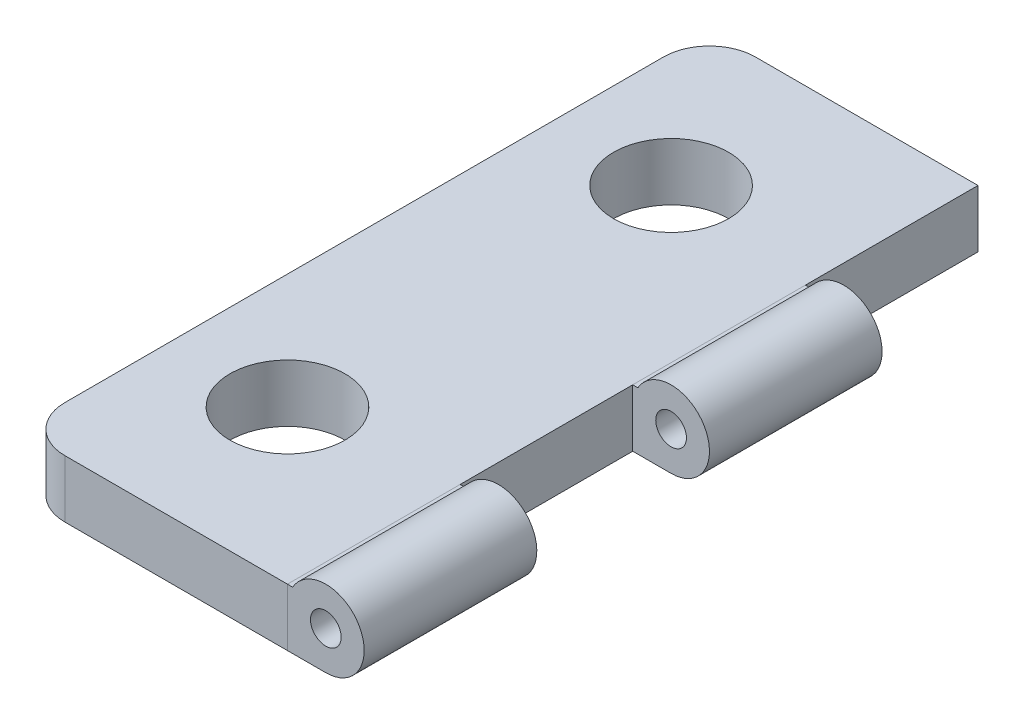
ISO-10303-21;
HEADER;
FILE_DESCRIPTION(('STEP AP214'),'2;1');
FILE_NAME('part.step','',(''),(''),'','','');
FILE_SCHEMA(('AUTOMOTIVE_DESIGN { 1 0 10303 214 1 1 1 1 }'));
ENDSEC;
DATA;
#1=APPLICATION_CONTEXT('core data for automotive mechanical design processes');
#2=APPLICATION_PROTOCOL_DEFINITION('international standard','automotive_design',2000,#1);
#3=PRODUCT_CONTEXT('',#1,'mechanical');
#4=PRODUCT('Part','Part','',(#3));
#5=PRODUCT_RELATED_PRODUCT_CATEGORY('part','',(#4));
#6=PRODUCT_DEFINITION_FORMATION('','',#4);
#7=PRODUCT_DEFINITION_CONTEXT('part definition',#1,'design');
#8=PRODUCT_DEFINITION('design','',#6,#7);
#9=PRODUCT_DEFINITION_SHAPE('','',#8);
#10=(LENGTH_UNIT() NAMED_UNIT(*) SI_UNIT(.MILLI.,.METRE.));
#11=(NAMED_UNIT(*) PLANE_ANGLE_UNIT() SI_UNIT($,.RADIAN.));
#12=(NAMED_UNIT(*) SI_UNIT($,.STERADIAN.) SOLID_ANGLE_UNIT());
#13=UNCERTAINTY_MEASURE_WITH_UNIT(LENGTH_MEASURE(1.E-05),#10,'distance_accuracy_value','');
#14=(GEOMETRIC_REPRESENTATION_CONTEXT(3) GLOBAL_UNCERTAINTY_ASSIGNED_CONTEXT((#13)) GLOBAL_UNIT_ASSIGNED_CONTEXT((#10,
#11,#12)) REPRESENTATION_CONTEXT('',''));
#15=CARTESIAN_POINT('',(0.,0.,0.));
#16=DIRECTION('',(0.,0.,1.));
#17=DIRECTION('',(1.,0.,0.));
#18=AXIS2_PLACEMENT_3D('',#15,#16,#17);
#19=CARTESIAN_POINT('',(8.,1.,-18.));
#20=DIRECTION('',(0.,0.,1.));
#21=DIRECTION('',(1.,0.,0.));
#22=AXIS2_PLACEMENT_3D('',#19,#20,#21);
#23=CYLINDRICAL_SURFACE('',#22,1.);
#24=CARTESIAN_POINT('',(8.,1.,-4.5));
#25=DIRECTION('',(0.,0.,1.));
#26=DIRECTION('',(1.,0.,0.));
#27=AXIS2_PLACEMENT_3D('',#24,#25,#26);
#28=CIRCLE('',#27,1.);
#29=CARTESIAN_POINT('',(7.13397459621556,1.5,-4.5));
#30=VERTEX_POINT('',#29);
#31=CARTESIAN_POINT('',(8.,0.,-4.5));
#32=VERTEX_POINT('',#31);
#33=EDGE_CURVE('E58',#30,#32,#28,.F.);
#34=ORIENTED_EDGE('',*,*,#33,.F.);
#35=DIRECTION('',(0.,0.,1.));
#36=VECTOR('',#35,1.);
#37=CARTESIAN_POINT('',(7.13397459621556,1.5,-18.));
#38=LINE('',#37,#36);
#39=CARTESIAN_POINT('',(7.13397459621556,1.5,0.));
#40=VERTEX_POINT('',#39);
#41=EDGE_CURVE('E52',#30,#40,#38,.T.);
#42=ORIENTED_EDGE('',*,*,#41,.T.);
#43=CARTESIAN_POINT('',(8.,1.,0.));
#44=DIRECTION('',(0.,0.,1.));
#45=DIRECTION('',(1.,0.,0.));
#46=AXIS2_PLACEMENT_3D('',#43,#44,#45);
#47=CIRCLE('',#46,1.);
#48=CARTESIAN_POINT('',(8.,0.,0.));
#49=VERTEX_POINT('',#48);
#50=EDGE_CURVE('E96',#49,#40,#47,.T.);
#51=ORIENTED_EDGE('',*,*,#50,.F.);
#52=DIRECTION('',(0.,0.,1.));
#53=VECTOR('',#52,1.);
#54=CARTESIAN_POINT('',(8.,0.,-18.));
#55=LINE('',#54,#53);
#56=EDGE_CURVE('E92',#32,#49,#55,.T.);
#57=ORIENTED_EDGE('',*,*,#56,.F.);
#58=EDGE_LOOP('',(#34,#42,#51,#57));
#59=FACE_BOUND('',#58,.T.);
#60=ADVANCED_FACE('F48',(#59),#23,.T.);
#61=CARTESIAN_POINT('',(0.,0.,-18.));
#62=DIRECTION('',(0.,-1.,0.));
#63=DIRECTION('',(0.,0.,-1.));
#64=AXIS2_PLACEMENT_3D('',#61,#62,#63);
#65=PLANE('',#64);
#66=DIRECTION('',(-1.,0.,0.));
#67=VECTOR('',#66,1.);
#68=CARTESIAN_POINT('',(9.,0.,-4.5));
#69=LINE('',#68,#67);
#70=CARTESIAN_POINT('',(7.,0.,-4.5));
#71=VERTEX_POINT('',#70);
#72=EDGE_CURVE('E12',#32,#71,#69,.T.);
#73=ORIENTED_EDGE('',*,*,#72,.F.);
#74=ORIENTED_EDGE('',*,*,#56,.T.);
#75=DIRECTION('',(1.,0.,0.));
#76=VECTOR('',#75,1.);
#77=CARTESIAN_POINT('',(0.,0.,0.));
#78=LINE('',#77,#76);
#79=CARTESIAN_POINT('',(7.,0.,0.));
#80=VERTEX_POINT('',#79);
#81=EDGE_CURVE('E105',#80,#49,#78,.T.);
#82=ORIENTED_EDGE('',*,*,#81,.F.);
#83=DIRECTION('',(0.,0.,1.));
#84=VECTOR('',#83,1.);
#85=CARTESIAN_POINT('',(7.,0.,-18.));
#86=LINE('',#85,#84);
#87=EDGE_CURVE('E121',#71,#80,#86,.T.);
#88=ORIENTED_EDGE('',*,*,#87,.F.);
#89=EDGE_LOOP('',(#73,#74,#82,#88));
#90=FACE_BOUND('',#89,.T.);
#91=ADVANCED_FACE('F128',(#90),#65,.T.);
#92=CARTESIAN_POINT('',(7.,0.,-18.));
#93=DIRECTION('',(1.,0.,0.));
#94=DIRECTION('',(0.,0.,-1.));
#95=AXIS2_PLACEMENT_3D('',#92,#93,#94);
#96=PLANE('',#95);
#97=DIRECTION('',(0.,0.,1.));
#98=VECTOR('',#97,1.);
#99=CARTESIAN_POINT('',(7.,1.5,-18.));
#100=LINE('',#99,#98);
#101=CARTESIAN_POINT('',(7.,1.5,-4.5));
#102=VERTEX_POINT('',#101);
#103=CARTESIAN_POINT('',(7.,1.5,0.));
#104=VERTEX_POINT('',#103);
#105=EDGE_CURVE('E83',#102,#104,#100,.T.);
#106=ORIENTED_EDGE('',*,*,#105,.F.);
#107=DIRECTION('',(0.,-1.,0.));
#108=VECTOR('',#107,1.);
#109=CARTESIAN_POINT('',(7.,20.,-4.5));
#110=LINE('',#109,#108);
#111=EDGE_CURVE('E119',#102,#71,#110,.T.);
#112=ORIENTED_EDGE('',*,*,#111,.T.);
#113=ORIENTED_EDGE('',*,*,#87,.T.);
#114=DIRECTION('',(0.,1.,0.));
#115=VECTOR('',#114,1.);
#116=CARTESIAN_POINT('',(7.,0.,0.));
#117=LINE('',#116,#115);
#118=EDGE_CURVE('E117',#80,#104,#117,.T.);
#119=ORIENTED_EDGE('',*,*,#118,.T.);
#120=EDGE_LOOP('',(#106,#112,#113,#119));
#121=FACE_BOUND('',#120,.T.);
#122=ADVANCED_FACE('F126',(#121),#96,.F.);
#123=CARTESIAN_POINT('',(8.,1.,-18.));
#124=DIRECTION('',(0.,0.,1.));
#125=DIRECTION('',(1.,0.,0.));
#126=AXIS2_PLACEMENT_3D('',#123,#124,#125);
#127=CYLINDRICAL_SURFACE('',#126,0.399999999999999);
#128=CARTESIAN_POINT('',(8.,1.,-4.5));
#129=DIRECTION('',(0.,0.,1.));
#130=DIRECTION('',(1.,0.,0.));
#131=AXIS2_PLACEMENT_3D('',#128,#129,#130);
#132=CIRCLE('',#131,0.399999999999999);
#133=CARTESIAN_POINT('',(8.4,1.,-4.5));
#134=VERTEX_POINT('',#133);
#135=EDGE_CURVE('E114',#134,#134,#132,.F.);
#136=ORIENTED_EDGE('',*,*,#135,.T.);
#137=EDGE_LOOP('',(#136));
#138=FACE_BOUND('',#137,.T.);
#139=CARTESIAN_POINT('',(8.,1.,0.));
#140=DIRECTION('',(0.,0.,1.));
#141=DIRECTION('',(1.,0.,0.));
#142=AXIS2_PLACEMENT_3D('',#139,#140,#141);
#143=CIRCLE('',#142,0.399999999999999);
#144=CARTESIAN_POINT('',(8.4,1.,0.));
#145=VERTEX_POINT('',#144);
#146=EDGE_CURVE('E110',#145,#145,#143,.T.);
#147=ORIENTED_EDGE('',*,*,#146,.T.);
#148=EDGE_LOOP('',(#147));
#149=FACE_BOUND('',#148,.T.);
#150=ADVANCED_FACE('F50',(#138,#149),#127,.F.);
#151=CARTESIAN_POINT('',(0.,1.5,-18.));
#152=DIRECTION('',(0.,-1.,0.));
#153=DIRECTION('',(0.,0.,-1.));
#154=AXIS2_PLACEMENT_3D('',#151,#152,#153);
#155=PLANE('',#154);
#156=ORIENTED_EDGE('',*,*,#41,.F.);
#157=DIRECTION('',(-1.,0.,0.));
#158=VECTOR('',#157,1.);
#159=CARTESIAN_POINT('',(0.,1.5,-4.5));
#160=LINE('',#159,#158);
#161=EDGE_CURVE('E113',#30,#102,#160,.T.);
#162=ORIENTED_EDGE('',*,*,#161,.T.);
#163=ORIENTED_EDGE('',*,*,#105,.T.);
#164=DIRECTION('',(1.,0.,0.));
#165=VECTOR('',#164,1.);
#166=CARTESIAN_POINT('',(0.,1.5,0.));
#167=LINE('',#166,#165);
#168=EDGE_CURVE('E98',#104,#40,#167,.T.);
#169=ORIENTED_EDGE('',*,*,#168,.T.);
#170=EDGE_LOOP('',(#156,#162,#163,#169));
#171=FACE_BOUND('',#170,.T.);
#172=ADVANCED_FACE('F99',(#171),#155,.F.);
#173=CARTESIAN_POINT('',(0.,0.,0.));
#174=DIRECTION('',(0.,0.,1.));
#175=DIRECTION('',(1.,0.,0.));
#176=AXIS2_PLACEMENT_3D('',#173,#174,#175);
#177=PLANE('',#176);
#178=ORIENTED_EDGE('',*,*,#146,.F.);
#179=EDGE_LOOP('',(#178));
#180=FACE_BOUND('',#179,.T.);
#181=ORIENTED_EDGE('',*,*,#50,.T.);
#182=ORIENTED_EDGE('',*,*,#168,.F.);
#183=ORIENTED_EDGE('',*,*,#118,.F.);
#184=ORIENTED_EDGE('',*,*,#81,.T.);
#185=EDGE_LOOP('',(#181,#182,#183,#184));
#186=FACE_BOUND('',#185,.T.);
#187=ADVANCED_FACE('F104',(#180,#186),#177,.T.);
#188=CARTESIAN_POINT('',(9.,20.,-4.5));
#189=DIRECTION('',(0.,0.,1.));
#190=DIRECTION('',(1.,0.,0.));
#191=AXIS2_PLACEMENT_3D('',#188,#189,#190);
#192=PLANE('',#191);
#193=ORIENTED_EDGE('',*,*,#33,.T.);
#194=ORIENTED_EDGE('',*,*,#72,.T.);
#195=ORIENTED_EDGE('',*,*,#111,.F.);
#196=ORIENTED_EDGE('',*,*,#161,.F.);
#197=EDGE_LOOP('',(#193,#194,#195,#196));
#198=FACE_BOUND('',#197,.T.);
#199=ORIENTED_EDGE('',*,*,#135,.F.);
#200=EDGE_LOOP('',(#199));
#201=FACE_BOUND('',#200,.T.);
#202=ADVANCED_FACE('F129',(#198,#201),#192,.F.);
#203=CLOSED_SHELL('',(#60,#91,#122,#150,#172,#187,#202));
#204=MANIFOLD_SOLID_BREP('B2',#203);
#205=CARTESIAN_POINT('',(0.,1.5,-18.));
#206=DIRECTION('',(0.,-1.,0.));
#207=DIRECTION('',(0.,0.,-1.));
#208=AXIS2_PLACEMENT_3D('',#205,#206,#207);
#209=PLANE('',#208);
#210=DIRECTION('',(0.,0.,1.));
#211=VECTOR('',#210,1.);
#212=CARTESIAN_POINT('',(7.,1.5,-18.));
#213=LINE('',#212,#211);
#214=CARTESIAN_POINT('',(7.,1.5,-13.5));
#215=VERTEX_POINT('',#214);
#216=CARTESIAN_POINT('',(7.,1.5,-9.));
#217=VERTEX_POINT('',#216);
#218=EDGE_CURVE('E271',#215,#217,#213,.T.);
#219=ORIENTED_EDGE('',*,*,#218,.T.);
#220=DIRECTION('',(1.,0.,0.));
#221=VECTOR('',#220,1.);
#222=CARTESIAN_POINT('',(0.,1.5,-9.));
#223=LINE('',#222,#221);
#224=CARTESIAN_POINT('',(7.13397459621556,1.5,-9.));
#225=VERTEX_POINT('',#224);
#226=EDGE_CURVE('E46',#217,#225,#223,.T.);
#227=ORIENTED_EDGE('',*,*,#226,.T.);
#228=DIRECTION('',(0.,0.,1.));
#229=VECTOR('',#228,1.);
#230=CARTESIAN_POINT('',(7.13397459621556,1.5,-18.));
#231=LINE('',#230,#229);
#232=CARTESIAN_POINT('',(7.13397459621556,1.5,-13.5));
#233=VERTEX_POINT('',#232);
#234=EDGE_CURVE('E274',#233,#225,#231,.T.);
#235=ORIENTED_EDGE('',*,*,#234,.F.);
#236=DIRECTION('',(-1.,0.,0.));
#237=VECTOR('',#236,1.);
#238=CARTESIAN_POINT('',(0.,1.5,-13.5));
#239=LINE('',#238,#237);
#240=EDGE_CURVE('E219',#233,#215,#239,.T.);
#241=ORIENTED_EDGE('',*,*,#240,.T.);
#242=EDGE_LOOP('',(#219,#227,#235,#241));
#243=FACE_BOUND('',#242,.T.);
#244=ADVANCED_FACE('F211',(#243),#209,.F.);
#245=CARTESIAN_POINT('',(7.,0.,-18.));
#246=DIRECTION('',(1.,0.,0.));
#247=DIRECTION('',(0.,0.,-1.));
#248=AXIS2_PLACEMENT_3D('',#245,#246,#247);
#249=PLANE('',#248);
#250=DIRECTION('',(0.,0.,1.));
#251=VECTOR('',#250,1.);
#252=CARTESIAN_POINT('',(7.,0.,-18.));
#253=LINE('',#252,#251);
#254=CARTESIAN_POINT('',(7.,0.,-13.5));
#255=VERTEX_POINT('',#254);
#256=CARTESIAN_POINT('',(7.,0.,-9.));
#257=VERTEX_POINT('',#256);
#258=EDGE_CURVE('E266',#255,#257,#253,.T.);
#259=ORIENTED_EDGE('',*,*,#258,.T.);
#260=DIRECTION('',(0.,-1.,0.));
#261=VECTOR('',#260,1.);
#262=CARTESIAN_POINT('',(7.,20.,-9.));
#263=LINE('',#262,#261);
#264=EDGE_CURVE('E250',#217,#257,#263,.T.);
#265=ORIENTED_EDGE('',*,*,#264,.F.);
#266=ORIENTED_EDGE('',*,*,#218,.F.);
#267=DIRECTION('',(0.,-1.,0.));
#268=VECTOR('',#267,1.);
#269=CARTESIAN_POINT('',(7.,20.,-13.5));
#270=LINE('',#269,#268);
#271=EDGE_CURVE('E226',#215,#255,#270,.T.);
#272=ORIENTED_EDGE('',*,*,#271,.T.);
#273=EDGE_LOOP('',(#259,#265,#266,#272));
#274=FACE_BOUND('',#273,.T.);
#275=ADVANCED_FACE('F270',(#274),#249,.F.);
#276=CARTESIAN_POINT('',(0.,0.,-18.));
#277=DIRECTION('',(0.,-1.,0.));
#278=DIRECTION('',(0.,0.,-1.));
#279=AXIS2_PLACEMENT_3D('',#276,#277,#278);
#280=PLANE('',#279);
#281=DIRECTION('',(1.,0.,0.));
#282=VECTOR('',#281,1.);
#283=CARTESIAN_POINT('',(9.00000000000001,0.,-9.));
#284=LINE('',#283,#282);
#285=CARTESIAN_POINT('',(8.,0.,-9.));
#286=VERTEX_POINT('',#285);
#287=EDGE_CURVE('E254',#257,#286,#284,.T.);
#288=ORIENTED_EDGE('',*,*,#287,.F.);
#289=ORIENTED_EDGE('',*,*,#258,.F.);
#290=DIRECTION('',(-1.,0.,0.));
#291=VECTOR('',#290,1.);
#292=CARTESIAN_POINT('',(7.,0.,-13.5));
#293=LINE('',#292,#291);
#294=CARTESIAN_POINT('',(8.,0.,-13.5));
#295=VERTEX_POINT('',#294);
#296=EDGE_CURVE('E284',#295,#255,#293,.T.);
#297=ORIENTED_EDGE('',*,*,#296,.F.);
#298=DIRECTION('',(0.,0.,1.));
#299=VECTOR('',#298,1.);
#300=CARTESIAN_POINT('',(8.,0.,-18.));
#301=LINE('',#300,#299);
#302=EDGE_CURVE('E268',#295,#286,#301,.T.);
#303=ORIENTED_EDGE('',*,*,#302,.T.);
#304=EDGE_LOOP('',(#288,#289,#297,#303));
#305=FACE_BOUND('',#304,.T.);
#306=ADVANCED_FACE('F264',(#305),#280,.T.);
#307=CARTESIAN_POINT('',(8.,1.,-18.));
#308=DIRECTION('',(0.,0.,1.));
#309=DIRECTION('',(1.,0.,0.));
#310=AXIS2_PLACEMENT_3D('',#307,#308,#309);
#311=CYLINDRICAL_SURFACE('',#310,1.);
#312=CARTESIAN_POINT('',(8.,1.,-9.));
#313=DIRECTION('',(0.,0.,-1.));
#314=DIRECTION('',(-1.,0.,0.));
#315=AXIS2_PLACEMENT_3D('',#312,#313,#314);
#316=CIRCLE('',#315,1.);
#317=EDGE_CURVE('E234',#286,#225,#316,.F.);
#318=ORIENTED_EDGE('',*,*,#317,.F.);
#319=ORIENTED_EDGE('',*,*,#302,.F.);
#320=CARTESIAN_POINT('',(8.,1.,-13.5));
#321=DIRECTION('',(0.,0.,1.));
#322=DIRECTION('',(1.,0.,0.));
#323=AXIS2_PLACEMENT_3D('',#320,#321,#322);
#324=CIRCLE('',#323,1.);
#325=EDGE_CURVE('E259',#233,#295,#324,.F.);
#326=ORIENTED_EDGE('',*,*,#325,.F.);
#327=ORIENTED_EDGE('',*,*,#234,.T.);
#328=EDGE_LOOP('',(#318,#319,#326,#327));
#329=FACE_BOUND('',#328,.T.);
#330=ADVANCED_FACE('F289',(#329),#311,.T.);
#331=CARTESIAN_POINT('',(7.,20.,-13.5));
#332=DIRECTION('',(0.,0.,1.));
#333=DIRECTION('',(1.,0.,0.));
#334=AXIS2_PLACEMENT_3D('',#331,#332,#333);
#335=PLANE('',#334);
#336=ORIENTED_EDGE('',*,*,#325,.T.);
#337=ORIENTED_EDGE('',*,*,#296,.T.);
#338=ORIENTED_EDGE('',*,*,#271,.F.);
#339=ORIENTED_EDGE('',*,*,#240,.F.);
#340=EDGE_LOOP('',(#336,#337,#338,#339));
#341=FACE_BOUND('',#340,.T.);
#342=CARTESIAN_POINT('',(8.,1.,-13.5));
#343=DIRECTION('',(0.,0.,1.));
#344=DIRECTION('',(1.,0.,0.));
#345=AXIS2_PLACEMENT_3D('',#342,#343,#344);
#346=CIRCLE('',#345,0.399999999999999);
#347=CARTESIAN_POINT('',(8.4,1.,-13.5));
#348=VERTEX_POINT('',#347);
#349=EDGE_CURVE('E286',#348,#348,#346,.F.);
#350=ORIENTED_EDGE('',*,*,#349,.F.);
#351=EDGE_LOOP('',(#350));
#352=FACE_BOUND('',#351,.T.);
#353=ADVANCED_FACE('F282',(#341,#352),#335,.F.);
#354=CARTESIAN_POINT('',(9.00000000000001,20.,-9.));
#355=DIRECTION('',(0.,0.,-1.));
#356=DIRECTION('',(-1.,0.,0.));
#357=AXIS2_PLACEMENT_3D('',#354,#355,#356);
#358=PLANE('',#357);
#359=ORIENTED_EDGE('',*,*,#317,.T.);
#360=ORIENTED_EDGE('',*,*,#226,.F.);
#361=ORIENTED_EDGE('',*,*,#264,.T.);
#362=ORIENTED_EDGE('',*,*,#287,.T.);
#363=EDGE_LOOP('',(#359,#360,#361,#362));
#364=FACE_BOUND('',#363,.T.);
#365=CARTESIAN_POINT('',(8.,1.,-9.));
#366=DIRECTION('',(0.,0.,-1.));
#367=DIRECTION('',(-1.,0.,0.));
#368=AXIS2_PLACEMENT_3D('',#365,#366,#367);
#369=CIRCLE('',#368,0.399999999999999);
#370=CARTESIAN_POINT('',(7.6,1.,-9.));
#371=VERTEX_POINT('',#370);
#372=EDGE_CURVE('E279',#371,#371,#369,.F.);
#373=ORIENTED_EDGE('',*,*,#372,.F.);
#374=EDGE_LOOP('',(#373));
#375=FACE_BOUND('',#374,.T.);
#376=ADVANCED_FACE('F252',(#364,#375),#358,.F.);
#377=CARTESIAN_POINT('',(8.,1.,-18.));
#378=DIRECTION('',(0.,0.,1.));
#379=DIRECTION('',(1.,0.,0.));
#380=AXIS2_PLACEMENT_3D('',#377,#378,#379);
#381=CYLINDRICAL_SURFACE('',#380,0.399999999999999);
#382=ORIENTED_EDGE('',*,*,#372,.T.);
#383=EDGE_LOOP('',(#382));
#384=FACE_BOUND('',#383,.T.);
#385=ORIENTED_EDGE('',*,*,#349,.T.);
#386=EDGE_LOOP('',(#385));
#387=FACE_BOUND('',#386,.T.);
#388=ADVANCED_FACE('F213',(#384,#387),#381,.F.);
#389=CLOSED_SHELL('',(#244,#275,#306,#330,#353,#376,#388));
#390=MANIFOLD_SOLID_BREP('B6',#389);
#391=CARTESIAN_POINT('',(0.,1.5,-18.));
#392=DIRECTION('',(0.,0.,-1.));
#393=DIRECTION('',(-1.,0.,0.));
#394=AXIS2_PLACEMENT_3D('',#391,#392,#393);
#395=PLANE('',#394);
#396=DIRECTION('',(1.,0.,0.));
#397=VECTOR('',#396,1.);
#398=CARTESIAN_POINT('',(0.,0.,-18.));
#399=LINE('',#398,#397);
#400=CARTESIAN_POINT('',(1.2,0.,-18.));
#401=VERTEX_POINT('',#400);
#402=CARTESIAN_POINT('',(7.,0.,-18.));
#403=VERTEX_POINT('',#402);
#404=EDGE_CURVE('E450',#401,#403,#399,.T.);
#405=ORIENTED_EDGE('',*,*,#404,.F.);
#406=DIRECTION('',(0.,-1.,0.));
#407=VECTOR('',#406,1.);
#408=CARTESIAN_POINT('',(1.2,1.5,-18.));
#409=LINE('',#408,#407);
#410=CARTESIAN_POINT('',(1.2,1.5,-18.));
#411=VERTEX_POINT('',#410);
#412=EDGE_CURVE('E209',#411,#401,#409,.T.);
#413=ORIENTED_EDGE('',*,*,#412,.F.);
#414=DIRECTION('',(1.,0.,0.));
#415=VECTOR('',#414,1.);
#416=CARTESIAN_POINT('',(0.,1.5,-18.));
#417=LINE('',#416,#415);
#418=CARTESIAN_POINT('',(7.,1.5,-18.));
#419=VERTEX_POINT('',#418);
#420=EDGE_CURVE('E506',#411,#419,#417,.T.);
#421=ORIENTED_EDGE('',*,*,#420,.T.);
#422=DIRECTION('',(0.,-1.,0.));
#423=VECTOR('',#422,1.);
#424=CARTESIAN_POINT('',(7.,1.5,-18.));
#425=LINE('',#424,#423);
#426=EDGE_CURVE('E376',#419,#403,#425,.T.);
#427=ORIENTED_EDGE('',*,*,#426,.T.);
#428=EDGE_LOOP('',(#405,#413,#421,#427));
#429=FACE_BOUND('',#428,.T.);
#430=ADVANCED_FACE('F359',(#429),#395,.T.);
#431=CARTESIAN_POINT('',(1.2,1.5,-16.8));
#432=DIRECTION('',(0.,-1.,0.));
#433=DIRECTION('',(0.,0.,-1.));
#434=AXIS2_PLACEMENT_3D('',#431,#432,#433);
#435=CYLINDRICAL_SURFACE('',#434,1.2);
#436=CARTESIAN_POINT('',(1.2,0.,-16.8));
#437=DIRECTION('',(0.,1.,0.));
#438=DIRECTION('',(0.,0.,1.));
#439=AXIS2_PLACEMENT_3D('',#436,#437,#438);
#440=CIRCLE('',#439,1.2);
#441=CARTESIAN_POINT('',(0.,0.,-16.8));
#442=VERTEX_POINT('',#441);
#443=EDGE_CURVE('E452',#401,#442,#440,.T.);
#444=ORIENTED_EDGE('',*,*,#443,.T.);
#445=DIRECTION('',(0.,-1.,0.));
#446=VECTOR('',#445,1.);
#447=CARTESIAN_POINT('',(0.,1.5,-16.8));
#448=LINE('',#447,#446);
#449=CARTESIAN_POINT('',(0.,1.5,-16.8));
#450=VERTEX_POINT('',#449);
#451=EDGE_CURVE('E368',#450,#442,#448,.T.);
#452=ORIENTED_EDGE('',*,*,#451,.F.);
#453=CARTESIAN_POINT('',(1.2,1.5,-16.8));
#454=DIRECTION('',(0.,1.,0.));
#455=DIRECTION('',(0.,0.,1.));
#456=AXIS2_PLACEMENT_3D('',#453,#454,#455);
#457=CIRCLE('',#456,1.2);
#458=EDGE_CURVE('E508',#411,#450,#457,.T.);
#459=ORIENTED_EDGE('',*,*,#458,.F.);
#460=ORIENTED_EDGE('',*,*,#412,.T.);
#461=EDGE_LOOP('',(#444,#452,#459,#460));
#462=FACE_BOUND('',#461,.T.);
#463=ADVANCED_FACE('F471',(#462),#435,.T.);
#464=CARTESIAN_POINT('',(0.,1.5,0.));
#465=DIRECTION('',(-1.,0.,0.));
#466=DIRECTION('',(0.,0.,1.));
#467=AXIS2_PLACEMENT_3D('',#464,#465,#466);
#468=PLANE('',#467);
#469=DIRECTION('',(0.,0.,-1.));
#470=VECTOR('',#469,1.);
#471=CARTESIAN_POINT('',(0.,0.,0.));
#472=LINE('',#471,#470);
#473=CARTESIAN_POINT('',(0.,0.,-1.2));
#474=VERTEX_POINT('',#473);
#475=EDGE_CURVE('E455',#474,#442,#472,.T.);
#476=ORIENTED_EDGE('',*,*,#475,.F.);
#477=DIRECTION('',(0.,-1.,0.));
#478=VECTOR('',#477,1.);
#479=CARTESIAN_POINT('',(0.,1.5,-1.2));
#480=LINE('',#479,#478);
#481=CARTESIAN_POINT('',(0.,1.5,-1.2));
#482=VERTEX_POINT('',#481);
#483=EDGE_CURVE('E424',#482,#474,#480,.T.);
#484=ORIENTED_EDGE('',*,*,#483,.F.);
#485=DIRECTION('',(0.,0.,-1.));
#486=VECTOR('',#485,1.);
#487=CARTESIAN_POINT('',(0.,1.5,0.));
#488=LINE('',#487,#486);
#489=EDGE_CURVE('E435',#482,#450,#488,.T.);
#490=ORIENTED_EDGE('',*,*,#489,.T.);
#491=ORIENTED_EDGE('',*,*,#451,.T.);
#492=EDGE_LOOP('',(#476,#484,#490,#491));
#493=FACE_BOUND('',#492,.T.);
#494=ADVANCED_FACE('F468',(#493),#468,.T.);
#495=CARTESIAN_POINT('',(1.2,1.5,-1.2));
#496=DIRECTION('',(0.,-1.,0.));
#497=DIRECTION('',(0.,0.,-1.));
#498=AXIS2_PLACEMENT_3D('',#495,#496,#497);
#499=CYLINDRICAL_SURFACE('',#498,1.2);
#500=CARTESIAN_POINT('',(1.2,0.,-1.2));
#501=DIRECTION('',(0.,1.,0.));
#502=DIRECTION('',(0.,0.,1.));
#503=AXIS2_PLACEMENT_3D('',#500,#501,#502);
#504=CIRCLE('',#503,1.2);
#505=CARTESIAN_POINT('',(1.2,0.,0.));
#506=VERTEX_POINT('',#505);
#507=EDGE_CURVE('E420',#506,#474,#504,.F.);
#508=ORIENTED_EDGE('',*,*,#507,.F.);
#509=DIRECTION('',(0.,-1.,0.));
#510=VECTOR('',#509,1.);
#511=CARTESIAN_POINT('',(1.2,1.5,0.));
#512=LINE('',#511,#510);
#513=CARTESIAN_POINT('',(1.2,1.5,0.));
#514=VERTEX_POINT('',#513);
#515=EDGE_CURVE('E415',#514,#506,#512,.T.);
#516=ORIENTED_EDGE('',*,*,#515,.F.);
#517=CARTESIAN_POINT('',(1.2,1.5,-1.2));
#518=DIRECTION('',(0.,1.,0.));
#519=DIRECTION('',(0.,0.,1.));
#520=AXIS2_PLACEMENT_3D('',#517,#518,#519);
#521=CIRCLE('',#520,1.2);
#522=EDGE_CURVE('E418',#514,#482,#521,.F.);
#523=ORIENTED_EDGE('',*,*,#522,.T.);
#524=ORIENTED_EDGE('',*,*,#483,.T.);
#525=EDGE_LOOP('',(#508,#516,#523,#524));
#526=FACE_BOUND('',#525,.T.);
#527=ADVANCED_FACE('F417',(#526),#499,.T.);
#528=CARTESIAN_POINT('',(0.,1.5,0.));
#529=DIRECTION('',(0.,0.,1.));
#530=DIRECTION('',(1.,0.,0.));
#531=AXIS2_PLACEMENT_3D('',#528,#529,#530);
#532=PLANE('',#531);
#533=DIRECTION('',(-1.,0.,0.));
#534=VECTOR('',#533,1.);
#535=CARTESIAN_POINT('',(0.,0.,0.));
#536=LINE('',#535,#534);
#537=CARTESIAN_POINT('',(7.,0.,0.));
#538=VERTEX_POINT('',#537);
#539=EDGE_CURVE('E459',#538,#506,#536,.T.);
#540=ORIENTED_EDGE('',*,*,#539,.F.);
#541=DIRECTION('',(0.,-1.,0.));
#542=VECTOR('',#541,1.);
#543=CARTESIAN_POINT('',(7.,1.5,0.));
#544=LINE('',#543,#542);
#545=CARTESIAN_POINT('',(7.,1.5,0.));
#546=VERTEX_POINT('',#545);
#547=EDGE_CURVE('E425',#546,#538,#544,.T.);
#548=ORIENTED_EDGE('',*,*,#547,.F.);
#549=DIRECTION('',(-1.,0.,0.));
#550=VECTOR('',#549,1.);
#551=CARTESIAN_POINT('',(0.,1.5,0.));
#552=LINE('',#551,#550);
#553=EDGE_CURVE('E433',#546,#514,#552,.T.);
#554=ORIENTED_EDGE('',*,*,#553,.T.);
#555=ORIENTED_EDGE('',*,*,#515,.T.);
#556=EDGE_LOOP('',(#540,#548,#554,#555));
#557=FACE_BOUND('',#556,.T.);
#558=ADVANCED_FACE('F438',(#557),#532,.T.);
#559=CARTESIAN_POINT('',(3.,1.5,-14.));
#560=DIRECTION('',(0.,-1.,0.));
#561=DIRECTION('',(0.,0.,-1.));
#562=AXIS2_PLACEMENT_3D('',#559,#560,#561);
#563=CYLINDRICAL_SURFACE('',#562,1.5);
#564=CARTESIAN_POINT('',(3.,1.5,-14.));
#565=DIRECTION('',(0.,1.,0.));
#566=DIRECTION('',(0.,0.,1.));
#567=AXIS2_PLACEMENT_3D('',#564,#565,#566);
#568=CIRCLE('',#567,1.5);
#569=CARTESIAN_POINT('',(3.,1.5,-12.5));
#570=VERTEX_POINT('',#569);
#571=EDGE_CURVE('E503',#570,#570,#568,.T.);
#572=ORIENTED_EDGE('',*,*,#571,.T.);
#573=EDGE_LOOP('',(#572));
#574=FACE_BOUND('',#573,.T.);
#575=CARTESIAN_POINT('',(3.,0.,-14.));
#576=DIRECTION('',(0.,1.,0.));
#577=DIRECTION('',(0.,0.,1.));
#578=AXIS2_PLACEMENT_3D('',#575,#576,#577);
#579=CIRCLE('',#578,1.5);
#580=CARTESIAN_POINT('',(3.,0.,-12.5));
#581=VERTEX_POINT('',#580);
#582=EDGE_CURVE('E447',#581,#581,#579,.T.);
#583=ORIENTED_EDGE('',*,*,#582,.F.);
#584=EDGE_LOOP('',(#583));
#585=FACE_BOUND('',#584,.T.);
#586=ADVANCED_FACE('F491',(#574,#585),#563,.F.);
#587=CARTESIAN_POINT('',(3.,1.5,-4.));
#588=DIRECTION('',(0.,-1.,0.));
#589=DIRECTION('',(0.,0.,-1.));
#590=AXIS2_PLACEMENT_3D('',#587,#588,#589);
#591=CYLINDRICAL_SURFACE('',#590,1.5);
#592=CARTESIAN_POINT('',(3.,1.5,-4.));
#593=DIRECTION('',(0.,1.,0.));
#594=DIRECTION('',(0.,0.,1.));
#595=AXIS2_PLACEMENT_3D('',#592,#593,#594);
#596=CIRCLE('',#595,1.5);
#597=CARTESIAN_POINT('',(3.,1.5,-2.5));
#598=VERTEX_POINT('',#597);
#599=EDGE_CURVE('E462',#598,#598,#596,.T.);
#600=ORIENTED_EDGE('',*,*,#599,.T.);
#601=EDGE_LOOP('',(#600));
#602=FACE_BOUND('',#601,.T.);
#603=CARTESIAN_POINT('',(3.,0.,-4.));
#604=DIRECTION('',(0.,1.,0.));
#605=DIRECTION('',(0.,0.,1.));
#606=AXIS2_PLACEMENT_3D('',#603,#604,#605);
#607=CIRCLE('',#606,1.5);
#608=CARTESIAN_POINT('',(3.,0.,-2.5));
#609=VERTEX_POINT('',#608);
#610=EDGE_CURVE('E444',#609,#609,#607,.T.);
#611=ORIENTED_EDGE('',*,*,#610,.F.);
#612=EDGE_LOOP('',(#611));
#613=FACE_BOUND('',#612,.T.);
#614=ADVANCED_FACE('F361',(#602,#613),#591,.F.);
#615=CARTESIAN_POINT('',(7.,1.5,0.));
#616=DIRECTION('',(1.,0.,0.));
#617=DIRECTION('',(0.,0.,-1.));
#618=AXIS2_PLACEMENT_3D('',#615,#616,#617);
#619=PLANE('',#618);
#620=ORIENTED_EDGE('',*,*,#547,.T.);
#621=DIRECTION('',(0.,0.,1.));
#622=VECTOR('',#621,1.);
#623=CARTESIAN_POINT('',(7.,0.,0.));
#624=LINE('',#623,#622);
#625=EDGE_CURVE('E397',#403,#538,#624,.T.);
#626=ORIENTED_EDGE('',*,*,#625,.F.);
#627=ORIENTED_EDGE('',*,*,#426,.F.);
#628=DIRECTION('',(0.,0.,1.));
#629=VECTOR('',#628,1.);
#630=CARTESIAN_POINT('',(7.,1.5,0.));
#631=LINE('',#630,#629);
#632=EDGE_CURVE('E439',#419,#546,#631,.T.);
#633=ORIENTED_EDGE('',*,*,#632,.T.);
#634=EDGE_LOOP('',(#620,#626,#627,#633));
#635=FACE_BOUND('',#634,.T.);
#636=ADVANCED_FACE('F479',(#635),#619,.T.);
#637=CARTESIAN_POINT('',(0.,1.5,0.));
#638=DIRECTION('',(0.,1.,0.));
#639=DIRECTION('',(0.,0.,1.));
#640=AXIS2_PLACEMENT_3D('',#637,#638,#639);
#641=PLANE('',#640);
#642=ORIENTED_EDGE('',*,*,#599,.F.);
#643=EDGE_LOOP('',(#642));
#644=FACE_BOUND('',#643,.T.);
#645=ORIENTED_EDGE('',*,*,#571,.F.);
#646=EDGE_LOOP('',(#645));
#647=FACE_BOUND('',#646,.T.);
#648=ORIENTED_EDGE('',*,*,#420,.F.);
#649=ORIENTED_EDGE('',*,*,#458,.T.);
#650=ORIENTED_EDGE('',*,*,#489,.F.);
#651=ORIENTED_EDGE('',*,*,#522,.F.);
#652=ORIENTED_EDGE('',*,*,#553,.F.);
#653=ORIENTED_EDGE('',*,*,#632,.F.);
#654=EDGE_LOOP('',(#648,#649,#650,#651,#652,#653));
#655=FACE_BOUND('',#654,.T.);
#656=ADVANCED_FACE('F431',(#644,#647,#655),#641,.T.);
#657=CARTESIAN_POINT('',(0.,0.,0.));
#658=DIRECTION('',(0.,1.,0.));
#659=DIRECTION('',(0.,0.,1.));
#660=AXIS2_PLACEMENT_3D('',#657,#658,#659);
#661=PLANE('',#660);
#662=ORIENTED_EDGE('',*,*,#610,.T.);
#663=EDGE_LOOP('',(#662));
#664=FACE_BOUND('',#663,.T.);
#665=ORIENTED_EDGE('',*,*,#582,.T.);
#666=EDGE_LOOP('',(#665));
#667=FACE_BOUND('',#666,.T.);
#668=ORIENTED_EDGE('',*,*,#404,.T.);
#669=ORIENTED_EDGE('',*,*,#625,.T.);
#670=ORIENTED_EDGE('',*,*,#539,.T.);
#671=ORIENTED_EDGE('',*,*,#507,.T.);
#672=ORIENTED_EDGE('',*,*,#475,.T.);
#673=ORIENTED_EDGE('',*,*,#443,.F.);
#674=EDGE_LOOP('',(#668,#669,#670,#671,#672,#673));
#675=FACE_BOUND('',#674,.T.);
#676=ADVANCED_FACE('F472',(#664,#667,#675),#661,.F.);
#677=CLOSED_SHELL('',(#430,#463,#494,#527,#558,#586,#614,#636,#656,#676));
#678=MANIFOLD_SOLID_BREP('B40',#677);
#679=ADVANCED_BREP_SHAPE_REPRESENTATION('',(#18,#204,#390,#678),#14);
#680=SHAPE_DEFINITION_REPRESENTATION(#9,#679);
ENDSEC;
END-ISO-10303-21;
